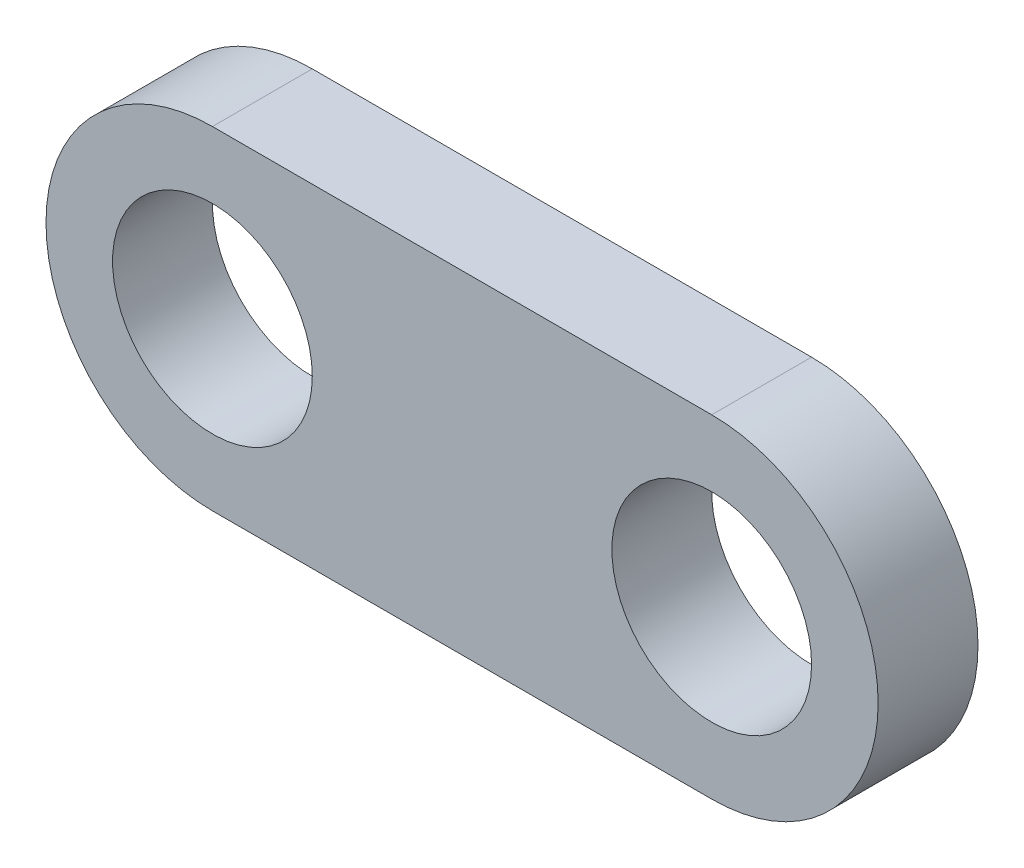
ISO-10303-21;
HEADER;
FILE_DESCRIPTION(('STEP AP214'),'2;1');
FILE_NAME('part.step','',(''),(''),'','','');
FILE_SCHEMA(('AUTOMOTIVE_DESIGN { 1 0 10303 214 1 1 1 1 }'));
ENDSEC;
DATA;
#1=APPLICATION_CONTEXT('core data for automotive mechanical design processes');
#2=APPLICATION_PROTOCOL_DEFINITION('international standard','automotive_design',2000,#1);
#3=PRODUCT_CONTEXT('',#1,'mechanical');
#4=PRODUCT('Part','Part','',(#3));
#5=PRODUCT_RELATED_PRODUCT_CATEGORY('part','',(#4));
#6=PRODUCT_DEFINITION_FORMATION('','',#4);
#7=PRODUCT_DEFINITION_CONTEXT('part definition',#1,'design');
#8=PRODUCT_DEFINITION('design','',#6,#7);
#9=PRODUCT_DEFINITION_SHAPE('','',#8);
#10=(LENGTH_UNIT() NAMED_UNIT(*) SI_UNIT(.MILLI.,.METRE.));
#11=(NAMED_UNIT(*) PLANE_ANGLE_UNIT() SI_UNIT($,.RADIAN.));
#12=(NAMED_UNIT(*) SI_UNIT($,.STERADIAN.) SOLID_ANGLE_UNIT());
#13=UNCERTAINTY_MEASURE_WITH_UNIT(LENGTH_MEASURE(1.E-05),#10,'distance_accuracy_value','');
#14=(GEOMETRIC_REPRESENTATION_CONTEXT(3) GLOBAL_UNCERTAINTY_ASSIGNED_CONTEXT((#13)) GLOBAL_UNIT_ASSIGNED_CONTEXT((#10,
#11,#12)) REPRESENTATION_CONTEXT('',''));
#15=CARTESIAN_POINT('',(0.,0.,0.));
#16=DIRECTION('',(0.,0.,1.));
#17=DIRECTION('',(1.,0.,0.));
#18=AXIS2_PLACEMENT_3D('',#15,#16,#17);
#19=CARTESIAN_POINT('',(-7.5,0.,3.));
#20=DIRECTION('',(0.,0.,1.));
#21=DIRECTION('',(1.,0.,0.));
#22=AXIS2_PLACEMENT_3D('',#19,#20,#21);
#23=PLANE('',#22);
#24=CARTESIAN_POINT('',(-7.5,0.,3.));
#25=DIRECTION('',(0.,0.,1.));
#26=DIRECTION('',(1.,0.,0.));
#27=AXIS2_PLACEMENT_3D('',#24,#25,#26);
#28=CIRCLE('',#27,3.);
#29=CARTESIAN_POINT('',(-4.5,0.,3.));
#30=VERTEX_POINT('',#29);
#31=EDGE_CURVE('E99',#30,#30,#28,.T.);
#32=ORIENTED_EDGE('',*,*,#31,.F.);
#33=EDGE_LOOP('',(#32));
#34=FACE_BOUND('',#33,.T.);
#35=CARTESIAN_POINT('',(-7.5,0.,3.));
#36=DIRECTION('',(0.,0.,1.));
#37=DIRECTION('',(1.,0.,0.));
#38=AXIS2_PLACEMENT_3D('',#35,#36,#37);
#39=CIRCLE('',#38,5.);
#40=CARTESIAN_POINT('',(-7.5,5.,3.));
#41=VERTEX_POINT('',#40);
#42=CARTESIAN_POINT('',(-7.5,-5.,3.));
#43=VERTEX_POINT('',#42);
#44=EDGE_CURVE('E84',#41,#43,#39,.T.);
#45=ORIENTED_EDGE('',*,*,#44,.T.);
#46=DIRECTION('',(1.,0.,0.));
#47=VECTOR('',#46,1.);
#48=CARTESIAN_POINT('',(-7.5,-5.,3.));
#49=LINE('',#48,#47);
#50=CARTESIAN_POINT('',(7.5,-5.,3.));
#51=VERTEX_POINT('',#50);
#52=EDGE_CURVE('E79',#43,#51,#49,.T.);
#53=ORIENTED_EDGE('',*,*,#52,.T.);
#54=CARTESIAN_POINT('',(7.5,0.,3.));
#55=DIRECTION('',(0.,0.,1.));
#56=DIRECTION('',(1.,0.,0.));
#57=AXIS2_PLACEMENT_3D('',#54,#55,#56);
#58=CIRCLE('',#57,5.);
#59=CARTESIAN_POINT('',(7.5,5.,3.));
#60=VERTEX_POINT('',#59);
#61=EDGE_CURVE('E82',#51,#60,#58,.T.);
#62=ORIENTED_EDGE('',*,*,#61,.T.);
#63=DIRECTION('',(-1.,0.,0.));
#64=VECTOR('',#63,1.);
#65=CARTESIAN_POINT('',(-7.5,5.,3.));
#66=LINE('',#65,#64);
#67=EDGE_CURVE('E49',#60,#41,#66,.T.);
#68=ORIENTED_EDGE('',*,*,#67,.T.);
#69=EDGE_LOOP('',(#45,#53,#62,#68));
#70=FACE_BOUND('',#69,.T.);
#71=CARTESIAN_POINT('',(7.5,0.,3.));
#72=DIRECTION('',(0.,0.,1.));
#73=DIRECTION('',(1.,0.,0.));
#74=AXIS2_PLACEMENT_3D('',#71,#72,#73);
#75=CIRCLE('',#74,3.);
#76=CARTESIAN_POINT('',(10.5,0.,3.));
#77=VERTEX_POINT('',#76);
#78=EDGE_CURVE('E114',#77,#77,#75,.T.);
#79=ORIENTED_EDGE('',*,*,#78,.F.);
#80=EDGE_LOOP('',(#79));
#81=FACE_BOUND('',#80,.T.);
#82=ADVANCED_FACE('F32',(#34,#70,#81),#23,.T.);
#83=CARTESIAN_POINT('',(-7.5,0.,0.));
#84=DIRECTION('',(0.,0.,1.));
#85=DIRECTION('',(1.,0.,0.));
#86=AXIS2_PLACEMENT_3D('',#83,#84,#85);
#87=PLANE('',#86);
#88=CARTESIAN_POINT('',(-7.5,0.,0.));
#89=DIRECTION('',(0.,0.,1.));
#90=DIRECTION('',(1.,0.,0.));
#91=AXIS2_PLACEMENT_3D('',#88,#89,#90);
#92=CIRCLE('',#91,5.);
#93=CARTESIAN_POINT('',(-7.5,5.,0.));
#94=VERTEX_POINT('',#93);
#95=CARTESIAN_POINT('',(-7.5,-5.,0.));
#96=VERTEX_POINT('',#95);
#97=EDGE_CURVE('E96',#94,#96,#92,.T.);
#98=ORIENTED_EDGE('',*,*,#97,.F.);
#99=DIRECTION('',(-1.,0.,0.));
#100=VECTOR('',#99,1.);
#101=CARTESIAN_POINT('',(-7.5,5.,0.));
#102=LINE('',#101,#100);
#103=CARTESIAN_POINT('',(7.5,5.,0.));
#104=VERTEX_POINT('',#103);
#105=EDGE_CURVE('E72',#104,#94,#102,.T.);
#106=ORIENTED_EDGE('',*,*,#105,.F.);
#107=CARTESIAN_POINT('',(7.5,0.,0.));
#108=DIRECTION('',(0.,0.,1.));
#109=DIRECTION('',(1.,0.,0.));
#110=AXIS2_PLACEMENT_3D('',#107,#108,#109);
#111=CIRCLE('',#110,5.);
#112=CARTESIAN_POINT('',(7.5,-5.,0.));
#113=VERTEX_POINT('',#112);
#114=EDGE_CURVE('E66',#113,#104,#111,.T.);
#115=ORIENTED_EDGE('',*,*,#114,.F.);
#116=DIRECTION('',(1.,0.,0.));
#117=VECTOR('',#116,1.);
#118=CARTESIAN_POINT('',(-7.5,-5.,0.));
#119=LINE('',#118,#117);
#120=EDGE_CURVE('E88',#96,#113,#119,.T.);
#121=ORIENTED_EDGE('',*,*,#120,.F.);
#122=EDGE_LOOP('',(#98,#106,#115,#121));
#123=FACE_BOUND('',#122,.T.);
#124=CARTESIAN_POINT('',(-7.5,0.,0.));
#125=DIRECTION('',(0.,0.,1.));
#126=DIRECTION('',(1.,0.,0.));
#127=AXIS2_PLACEMENT_3D('',#124,#125,#126);
#128=CIRCLE('',#127,3.);
#129=CARTESIAN_POINT('',(-4.5,0.,0.));
#130=VERTEX_POINT('',#129);
#131=EDGE_CURVE('E111',#130,#130,#128,.T.);
#132=ORIENTED_EDGE('',*,*,#131,.T.);
#133=EDGE_LOOP('',(#132));
#134=FACE_BOUND('',#133,.T.);
#135=CARTESIAN_POINT('',(7.5,0.,0.));
#136=DIRECTION('',(0.,0.,1.));
#137=DIRECTION('',(1.,0.,0.));
#138=AXIS2_PLACEMENT_3D('',#135,#136,#137);
#139=CIRCLE('',#138,3.);
#140=CARTESIAN_POINT('',(10.5,0.,0.));
#141=VERTEX_POINT('',#140);
#142=EDGE_CURVE('E117',#141,#141,#139,.T.);
#143=ORIENTED_EDGE('',*,*,#142,.T.);
#144=EDGE_LOOP('',(#143));
#145=FACE_BOUND('',#144,.T.);
#146=ADVANCED_FACE('F107',(#123,#134,#145),#87,.F.);
#147=CARTESIAN_POINT('',(-7.5,0.,3.));
#148=DIRECTION('',(0.,0.,-1.));
#149=DIRECTION('',(-1.,0.,0.));
#150=AXIS2_PLACEMENT_3D('',#147,#148,#149);
#151=CYLINDRICAL_SURFACE('',#150,5.);
#152=ORIENTED_EDGE('',*,*,#97,.T.);
#153=DIRECTION('',(0.,0.,-1.));
#154=VECTOR('',#153,1.);
#155=CARTESIAN_POINT('',(-7.5,-5.,3.));
#156=LINE('',#155,#154);
#157=EDGE_CURVE('E11',#43,#96,#156,.T.);
#158=ORIENTED_EDGE('',*,*,#157,.F.);
#159=ORIENTED_EDGE('',*,*,#44,.F.);
#160=DIRECTION('',(0.,0.,-1.));
#161=VECTOR('',#160,1.);
#162=CARTESIAN_POINT('',(-7.5,5.,3.));
#163=LINE('',#162,#161);
#164=EDGE_CURVE('E92',#41,#94,#163,.T.);
#165=ORIENTED_EDGE('',*,*,#164,.T.);
#166=EDGE_LOOP('',(#152,#158,#159,#165));
#167=FACE_BOUND('',#166,.T.);
#168=ADVANCED_FACE('F34',(#167),#151,.T.);
#169=CARTESIAN_POINT('',(-7.5,-5.,3.));
#170=DIRECTION('',(0.,1.,0.));
#171=DIRECTION('',(-1.,0.,0.));
#172=AXIS2_PLACEMENT_3D('',#169,#170,#171);
#173=PLANE('',#172);
#174=ORIENTED_EDGE('',*,*,#120,.T.);
#175=DIRECTION('',(0.,0.,-1.));
#176=VECTOR('',#175,1.);
#177=CARTESIAN_POINT('',(7.5,-5.,3.));
#178=LINE('',#177,#176);
#179=EDGE_CURVE('E41',#51,#113,#178,.T.);
#180=ORIENTED_EDGE('',*,*,#179,.F.);
#181=ORIENTED_EDGE('',*,*,#52,.F.);
#182=ORIENTED_EDGE('',*,*,#157,.T.);
#183=EDGE_LOOP('',(#174,#180,#181,#182));
#184=FACE_BOUND('',#183,.T.);
#185=ADVANCED_FACE('F87',(#184),#173,.F.);
#186=CARTESIAN_POINT('',(7.5,0.,3.));
#187=DIRECTION('',(0.,0.,-1.));
#188=DIRECTION('',(-1.,0.,0.));
#189=AXIS2_PLACEMENT_3D('',#186,#187,#188);
#190=CYLINDRICAL_SURFACE('',#189,5.);
#191=ORIENTED_EDGE('',*,*,#114,.T.);
#192=DIRECTION('',(0.,0.,-1.));
#193=VECTOR('',#192,1.);
#194=CARTESIAN_POINT('',(7.5,5.,3.));
#195=LINE('',#194,#193);
#196=EDGE_CURVE('E89',#60,#104,#195,.T.);
#197=ORIENTED_EDGE('',*,*,#196,.F.);
#198=ORIENTED_EDGE('',*,*,#61,.F.);
#199=ORIENTED_EDGE('',*,*,#179,.T.);
#200=EDGE_LOOP('',(#191,#197,#198,#199));
#201=FACE_BOUND('',#200,.T.);
#202=ADVANCED_FACE('F90',(#201),#190,.T.);
#203=CARTESIAN_POINT('',(-7.5,5.,3.));
#204=DIRECTION('',(0.,-1.,0.));
#205=DIRECTION('',(1.,0.,0.));
#206=AXIS2_PLACEMENT_3D('',#203,#204,#205);
#207=PLANE('',#206);
#208=ORIENTED_EDGE('',*,*,#105,.T.);
#209=ORIENTED_EDGE('',*,*,#164,.F.);
#210=ORIENTED_EDGE('',*,*,#67,.F.);
#211=ORIENTED_EDGE('',*,*,#196,.T.);
#212=EDGE_LOOP('',(#208,#209,#210,#211));
#213=FACE_BOUND('',#212,.T.);
#214=ADVANCED_FACE('F104',(#213),#207,.F.);
#215=CARTESIAN_POINT('',(-7.5,0.,3.));
#216=DIRECTION('',(0.,0.,-1.));
#217=DIRECTION('',(-1.,0.,0.));
#218=AXIS2_PLACEMENT_3D('',#215,#216,#217);
#219=CYLINDRICAL_SURFACE('',#218,3.);
#220=ORIENTED_EDGE('',*,*,#31,.T.);
#221=EDGE_LOOP('',(#220));
#222=FACE_BOUND('',#221,.T.);
#223=ORIENTED_EDGE('',*,*,#131,.F.);
#224=EDGE_LOOP('',(#223));
#225=FACE_BOUND('',#224,.T.);
#226=ADVANCED_FACE('F134',(#222,#225),#219,.F.);
#227=CARTESIAN_POINT('',(7.5,0.,3.));
#228=DIRECTION('',(0.,0.,-1.));
#229=DIRECTION('',(-1.,0.,0.));
#230=AXIS2_PLACEMENT_3D('',#227,#228,#229);
#231=CYLINDRICAL_SURFACE('',#230,3.);
#232=ORIENTED_EDGE('',*,*,#78,.T.);
#233=EDGE_LOOP('',(#232));
#234=FACE_BOUND('',#233,.T.);
#235=ORIENTED_EDGE('',*,*,#142,.F.);
#236=EDGE_LOOP('',(#235));
#237=FACE_BOUND('',#236,.T.);
#238=ADVANCED_FACE('F123',(#234,#237),#231,.F.);
#239=CLOSED_SHELL('',(#82,#146,#168,#185,#202,#214,#226,#238));
#240=MANIFOLD_SOLID_BREP('B2',#239);
#241=ADVANCED_BREP_SHAPE_REPRESENTATION('',(#18,#240),#14);
#242=SHAPE_DEFINITION_REPRESENTATION(#9,#241);
ENDSEC;
END-ISO-10303-21;
